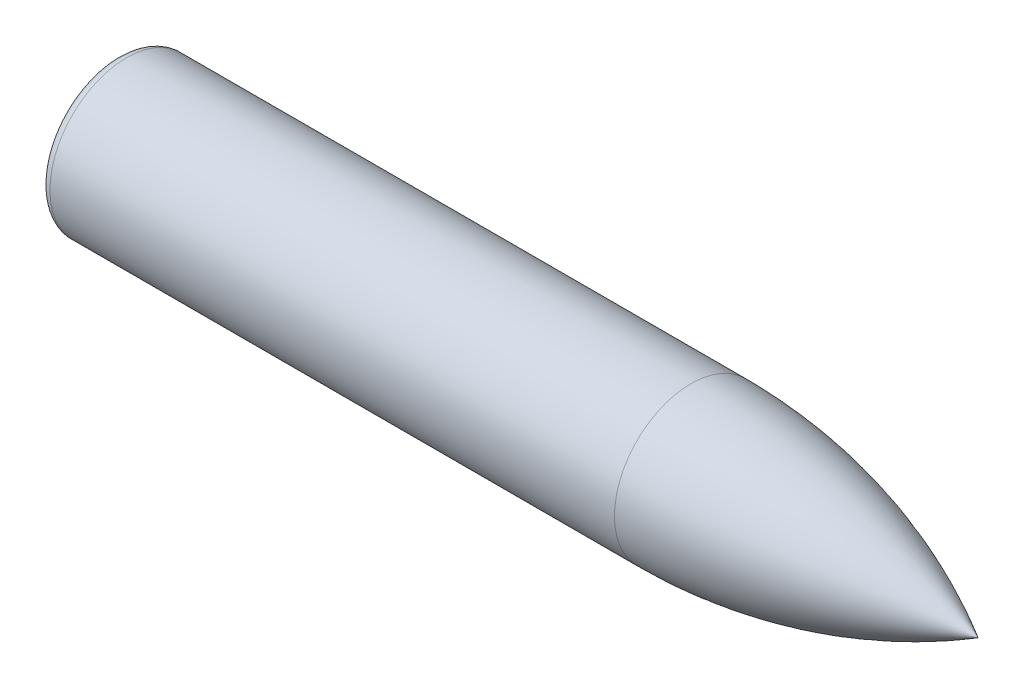
ISO-10303-21;
HEADER;
FILE_DESCRIPTION(('STEP AP214'),'2;1');
FILE_NAME('part.step','',(''),(''),'','','');
FILE_SCHEMA(('AUTOMOTIVE_DESIGN { 1 0 10303 214 1 1 1 1 }'));
ENDSEC;
DATA;
#1=APPLICATION_CONTEXT('core data for automotive mechanical design processes');
#2=APPLICATION_PROTOCOL_DEFINITION('international standard','automotive_design',2000,#1);
#3=PRODUCT_CONTEXT('',#1,'mechanical');
#4=PRODUCT('Part','Part','',(#3));
#5=PRODUCT_RELATED_PRODUCT_CATEGORY('part','',(#4));
#6=PRODUCT_DEFINITION_FORMATION('','',#4);
#7=PRODUCT_DEFINITION_CONTEXT('part definition',#1,'design');
#8=PRODUCT_DEFINITION('design','',#6,#7);
#9=PRODUCT_DEFINITION_SHAPE('','',#8);
#10=(LENGTH_UNIT() NAMED_UNIT(*) SI_UNIT(.MILLI.,.METRE.));
#11=(NAMED_UNIT(*) PLANE_ANGLE_UNIT() SI_UNIT($,.RADIAN.));
#12=(NAMED_UNIT(*) SI_UNIT($,.STERADIAN.) SOLID_ANGLE_UNIT());
#13=UNCERTAINTY_MEASURE_WITH_UNIT(LENGTH_MEASURE(1.E-05),#10,'distance_accuracy_value','');
#14=(GEOMETRIC_REPRESENTATION_CONTEXT(3) GLOBAL_UNCERTAINTY_ASSIGNED_CONTEXT((#13)) GLOBAL_UNIT_ASSIGNED_CONTEXT((#10,
#11,#12)) REPRESENTATION_CONTEXT('',''));
#15=CARTESIAN_POINT('',(0.,0.,0.));
#16=DIRECTION('',(0.,0.,1.));
#17=DIRECTION('',(1.,0.,0.));
#18=AXIS2_PLACEMENT_3D('',#15,#16,#17);
#19=CARTESIAN_POINT('',(0.,0.,0.));
#20=DIRECTION('',(1.,0.,0.));
#21=DIRECTION('',(0.,0.,-1.));
#22=AXIS2_PLACEMENT_3D('',#19,#20,#21);
#23=PLANE('',#22);
#24=CARTESIAN_POINT('',(0.,0.,0.));
#25=DIRECTION('',(1.,0.,0.));
#26=DIRECTION('',(0.,0.,-1.));
#27=AXIS2_PLACEMENT_3D('',#24,#25,#26);
#28=CIRCLE('',#27,140.);
#29=CARTESIAN_POINT('',(0.,0.,-140.));
#30=VERTEX_POINT('',#29);
#31=EDGE_CURVE('E44',#30,#30,#28,.F.);
#32=ORIENTED_EDGE('',*,*,#31,.T.);
#33=EDGE_LOOP('',(#32));
#34=FACE_BOUND('',#33,.T.);
#35=ADVANCED_FACE('F37',(#34),#23,.F.);
#36=CARTESIAN_POINT('',(0.,0.,0.));
#37=DIRECTION('',(-1.,0.,0.));
#38=DIRECTION('',(0.,0.,1.));
#39=AXIS2_PLACEMENT_3D('',#36,#37,#38);
#40=CYLINDRICAL_SURFACE('',#39,160.);
#41=CARTESIAN_POINT('',(20.,0.,0.));
#42=DIRECTION('',(1.,0.,0.));
#43=DIRECTION('',(0.,0.,-1.));
#44=AXIS2_PLACEMENT_3D('',#41,#42,#43);
#45=CIRCLE('',#44,160.);
#46=CARTESIAN_POINT('',(20.,0.,-160.));
#47=VERTEX_POINT('',#46);
#48=EDGE_CURVE('E11',#47,#47,#45,.T.);
#49=ORIENTED_EDGE('',*,*,#48,.T.);
#50=EDGE_LOOP('',(#49));
#51=FACE_BOUND('',#50,.T.);
#52=CARTESIAN_POINT('',(1200.,0.,0.));
#53=DIRECTION('',(-1.,0.,0.));
#54=DIRECTION('',(0.,0.,1.));
#55=AXIS2_PLACEMENT_3D('',#52,#53,#54);
#56=CIRCLE('',#55,160.);
#57=CARTESIAN_POINT('',(1200.,0.,160.));
#58=VERTEX_POINT('',#57);
#59=EDGE_CURVE('E67',#58,#58,#56,.T.);
#60=ORIENTED_EDGE('',*,*,#59,.T.);
#61=EDGE_LOOP('',(#60));
#62=FACE_BOUND('',#61,.T.);
#63=ADVANCED_FACE('F49',(#51,#62),#40,.T.);
#64=CARTESIAN_POINT('',(1200.,0.,-1045.));
#65=DIRECTION('',(0.,-1.,0.));
#66=DIRECTION('',(0.,0.,1.));
#67=AXIS2_PLACEMENT_3D('',#64,#65,#66);
#68=CIRCLE('',#67,1205.);
#69=TRIMMED_CURVE('',#68,(PARAMETER_VALUE(-0.521204783494682)),
(PARAMETER_VALUE(0.521204783494682)),.T.,.PARAMETER.);
#70=CARTESIAN_POINT('',(1200.,0.,0.));
#71=DIRECTION('',(-1.,0.,0.));
#72=AXIS1_PLACEMENT('',#70,#71);
#73=SURFACE_OF_REVOLUTION('',#69,#72);
#74=ORIENTED_EDGE('',*,*,#59,.F.);
#75=EDGE_LOOP('',(#74));
#76=FACE_BOUND('',#75,.T.);
#77=CARTESIAN_POINT('',(1800.,2.22044604925031E-13,0.));
#78=VERTEX_POINT('',#77);
#79=VERTEX_LOOP('',#78);
#80=FACE_BOUND('',#79,.T.);
#81=ADVANCED_FACE('F47',(#76,#80),#73,.T.);
#82=CARTESIAN_POINT('',(20.,0.,0.));
#83=DIRECTION('',(1.,0.,0.));
#84=DIRECTION('',(0.,0.,-1.));
#85=AXIS2_PLACEMENT_3D('',#82,#83,#84);
#86=TOROIDAL_SURFACE('',#85,140.,20.);
#87=ORIENTED_EDGE('',*,*,#48,.F.);
#88=EDGE_LOOP('',(#87));
#89=FACE_BOUND('',#88,.T.);
#90=ORIENTED_EDGE('',*,*,#31,.F.);
#91=EDGE_LOOP('',(#90));
#92=FACE_BOUND('',#91,.T.);
#93=ADVANCED_FACE('F39',(#89,#92),#86,.T.);
#94=CLOSED_SHELL('',(#35,#63,#81,#93));
#95=MANIFOLD_SOLID_BREP('B2',#94);
#96=ADVANCED_BREP_SHAPE_REPRESENTATION('',(#18,#95),#14);
#97=SHAPE_DEFINITION_REPRESENTATION(#9,#96);
ENDSEC;
END-ISO-10303-21;
